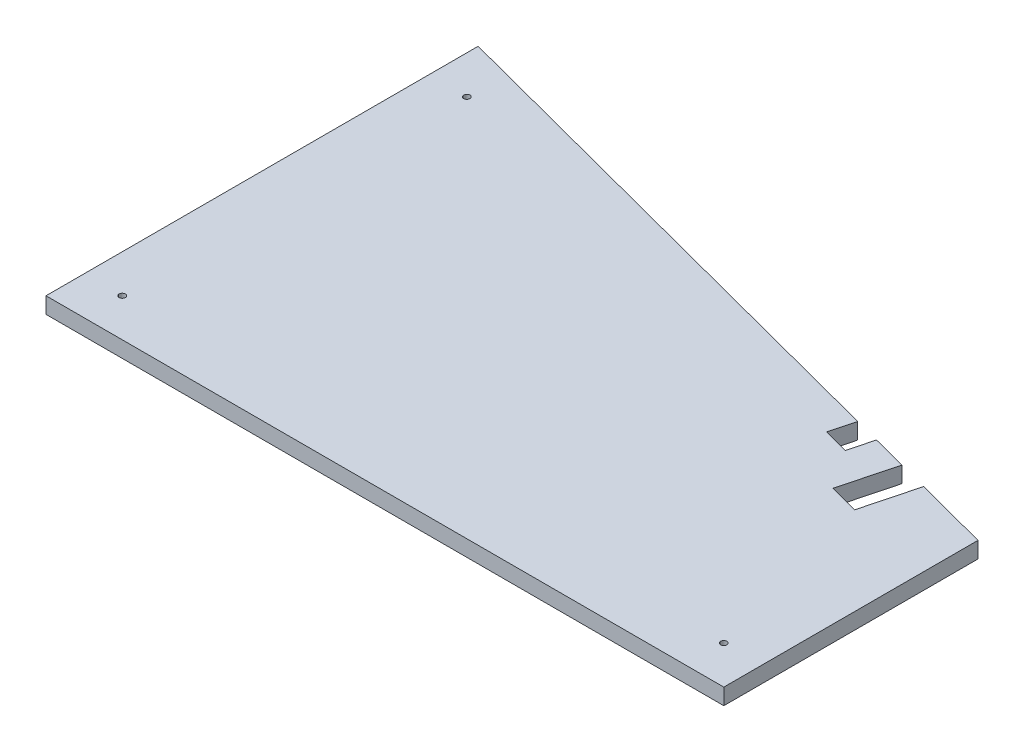
ISO-10303-21;
HEADER;
FILE_DESCRIPTION(('STEP AP214'),'2;1');
FILE_NAME('part.step','',(''),(''),'','','');
FILE_SCHEMA(('AUTOMOTIVE_DESIGN { 1 0 10303 214 1 1 1 1 }'));
ENDSEC;
DATA;
#1=APPLICATION_CONTEXT('core data for automotive mechanical design processes');
#2=APPLICATION_PROTOCOL_DEFINITION('international standard','automotive_design',2000,#1);
#3=PRODUCT_CONTEXT('',#1,'mechanical');
#4=PRODUCT('Part','Part','',(#3));
#5=PRODUCT_RELATED_PRODUCT_CATEGORY('part','',(#4));
#6=PRODUCT_DEFINITION_FORMATION('','',#4);
#7=PRODUCT_DEFINITION_CONTEXT('part definition',#1,'design');
#8=PRODUCT_DEFINITION('design','',#6,#7);
#9=PRODUCT_DEFINITION_SHAPE('','',#8);
#10=(LENGTH_UNIT() NAMED_UNIT(*) SI_UNIT(.MILLI.,.METRE.));
#11=(NAMED_UNIT(*) PLANE_ANGLE_UNIT() SI_UNIT($,.RADIAN.));
#12=(NAMED_UNIT(*) SI_UNIT($,.STERADIAN.) SOLID_ANGLE_UNIT());
#13=UNCERTAINTY_MEASURE_WITH_UNIT(LENGTH_MEASURE(1.E-05),#10,'distance_accuracy_value','');
#14=(GEOMETRIC_REPRESENTATION_CONTEXT(3) GLOBAL_UNCERTAINTY_ASSIGNED_CONTEXT((#13)) GLOBAL_UNIT_ASSIGNED_CONTEXT((#10,
#11,#12)) REPRESENTATION_CONTEXT('',''));
#15=CARTESIAN_POINT('',(0.,0.,0.));
#16=DIRECTION('',(0.,0.,1.));
#17=DIRECTION('',(1.,0.,0.));
#18=AXIS2_PLACEMENT_3D('',#15,#16,#17);
#19=CARTESIAN_POINT('',(-5.71070968291565E-12,6.35,-170.));
#20=DIRECTION('',(1.,0.,0.));
#21=DIRECTION('',(0.,0.,-1.));
#22=AXIS2_PLACEMENT_3D('',#19,#20,#21);
#23=PLANE('',#22);
#24=DIRECTION('',(0.,0.,1.));
#25=VECTOR('',#24,1.);
#26=CARTESIAN_POINT('',(-5.71070968291565E-12,0.,-170.));
#27=LINE('',#26,#25);
#28=CARTESIAN_POINT('',(-5.71070968291565E-12,0.,-170.));
#29=VERTEX_POINT('',#28);
#30=CARTESIAN_POINT('',(0.,0.,0.));
#31=VERTEX_POINT('',#30);
#32=EDGE_CURVE('E153',#29,#31,#27,.T.);
#33=ORIENTED_EDGE('',*,*,#32,.T.);
#34=DIRECTION('',(0.,-1.,0.));
#35=VECTOR('',#34,1.);
#36=CARTESIAN_POINT('',(0.,6.35,0.));
#37=LINE('',#36,#35);
#38=CARTESIAN_POINT('',(0.,6.35,0.));
#39=VERTEX_POINT('',#38);
#40=EDGE_CURVE('E11',#39,#31,#37,.T.);
#41=ORIENTED_EDGE('',*,*,#40,.F.);
#42=DIRECTION('',(0.,0.,1.));
#43=VECTOR('',#42,1.);
#44=CARTESIAN_POINT('',(-5.71070968291565E-12,6.35,-170.));
#45=LINE('',#44,#43);
#46=CARTESIAN_POINT('',(-5.71070968291565E-12,6.35,-170.));
#47=VERTEX_POINT('',#46);
#48=EDGE_CURVE('E176',#47,#39,#45,.T.);
#49=ORIENTED_EDGE('',*,*,#48,.F.);
#50=DIRECTION('',(0.,-1.,0.));
#51=VECTOR('',#50,1.);
#52=CARTESIAN_POINT('',(-5.71070968291565E-12,6.35,-170.));
#53=LINE('',#52,#51);
#54=EDGE_CURVE('E149',#47,#29,#53,.T.);
#55=ORIENTED_EDGE('',*,*,#54,.T.);
#56=EDGE_LOOP('',(#33,#41,#49,#55));
#57=FACE_BOUND('',#56,.T.);
#58=ADVANCED_FACE('F33',(#57),#23,.F.);
#59=CARTESIAN_POINT('',(0.,6.35,0.));
#60=DIRECTION('',(0.,0.,-1.));
#61=DIRECTION('',(-1.,0.,0.));
#62=AXIS2_PLACEMENT_3D('',#59,#60,#61);
#63=PLANE('',#62);
#64=DIRECTION('',(1.,0.,0.));
#65=VECTOR('',#64,1.);
#66=CARTESIAN_POINT('',(0.,0.,0.));
#67=LINE('',#66,#65);
#68=CARTESIAN_POINT('',(266.65,0.,0.));
#69=VERTEX_POINT('',#68);
#70=EDGE_CURVE('E156',#31,#69,#67,.T.);
#71=ORIENTED_EDGE('',*,*,#70,.T.);
#72=DIRECTION('',(0.,-1.,0.));
#73=VECTOR('',#72,1.);
#74=CARTESIAN_POINT('',(266.65,6.35,0.));
#75=LINE('',#74,#73);
#76=CARTESIAN_POINT('',(266.65,6.35,0.));
#77=VERTEX_POINT('',#76);
#78=EDGE_CURVE('E41',#77,#69,#75,.T.);
#79=ORIENTED_EDGE('',*,*,#78,.F.);
#80=DIRECTION('',(1.,0.,0.));
#81=VECTOR('',#80,1.);
#82=CARTESIAN_POINT('',(0.,6.35,0.));
#83=LINE('',#82,#81);
#84=EDGE_CURVE('E104',#39,#77,#83,.T.);
#85=ORIENTED_EDGE('',*,*,#84,.F.);
#86=ORIENTED_EDGE('',*,*,#40,.T.);
#87=EDGE_LOOP('',(#71,#79,#85,#86));
#88=FACE_BOUND('',#87,.T.);
#89=ADVANCED_FACE('F255',(#88),#63,.F.);
#90=CARTESIAN_POINT('',(266.65,6.35,0.));
#91=DIRECTION('',(-1.,0.,0.));
#92=DIRECTION('',(0.,0.,1.));
#93=AXIS2_PLACEMENT_3D('',#90,#91,#92);
#94=PLANE('',#93);
#95=DIRECTION('',(0.,0.,-1.));
#96=VECTOR('',#95,1.);
#97=CARTESIAN_POINT('',(266.65,0.,0.));
#98=LINE('',#97,#96);
#99=CARTESIAN_POINT('',(266.65,0.,-100.));
#100=VERTEX_POINT('',#99);
#101=EDGE_CURVE('E159',#69,#100,#98,.T.);
#102=ORIENTED_EDGE('',*,*,#101,.T.);
#103=DIRECTION('',(0.,-1.,0.));
#104=VECTOR('',#103,1.);
#105=CARTESIAN_POINT('',(266.65,6.35,-100.));
#106=LINE('',#105,#104);
#107=CARTESIAN_POINT('',(266.65,6.35,-100.));
#108=VERTEX_POINT('',#107);
#109=EDGE_CURVE('E195',#108,#100,#106,.T.);
#110=ORIENTED_EDGE('',*,*,#109,.F.);
#111=DIRECTION('',(0.,0.,-1.));
#112=VECTOR('',#111,1.);
#113=CARTESIAN_POINT('',(266.65,6.35,0.));
#114=LINE('',#113,#112);
#115=EDGE_CURVE('E203',#77,#108,#114,.T.);
#116=ORIENTED_EDGE('',*,*,#115,.F.);
#117=ORIENTED_EDGE('',*,*,#78,.T.);
#118=EDGE_LOOP('',(#102,#110,#116,#117));
#119=FACE_BOUND('',#118,.T.);
#120=ADVANCED_FACE('F201',(#119),#94,.F.);
#121=CARTESIAN_POINT('',(266.65,6.35,-100.));
#122=DIRECTION('',(-0.253912974923622,0.,0.967227068048365));
#123=DIRECTION('',(0.967227068048365,0.,0.253912974923622));
#124=AXIS2_PLACEMENT_3D('',#121,#122,#123);
#125=PLANE('',#124);
#126=DIRECTION('',(-0.967227068048365,0.,-0.253912974923622));
#127=VECTOR('',#126,1.);
#128=CARTESIAN_POINT('',(266.65,0.,-100.));
#129=LINE('',#128,#127);
#130=CARTESIAN_POINT('',(237.633187958549,0.,-107.617389247709));
#131=VERTEX_POINT('',#130);
#132=EDGE_CURVE('E161',#100,#131,#129,.T.);
#133=ORIENTED_EDGE('',*,*,#132,.T.);
#134=DIRECTION('',(0.,-1.,0.));
#135=VECTOR('',#134,1.);
#136=CARTESIAN_POINT('',(237.633187958549,6.35,-107.617389247709));
#137=LINE('',#136,#135);
#138=CARTESIAN_POINT('',(237.633187958549,6.35,-107.617389247709));
#139=VERTEX_POINT('',#138);
#140=EDGE_CURVE('E192',#139,#131,#137,.T.);
#141=ORIENTED_EDGE('',*,*,#140,.F.);
#142=DIRECTION('',(-0.967227068048365,0.,-0.253912974923622));
#143=VECTOR('',#142,1.);
#144=CARTESIAN_POINT('',(266.65,6.35,-100.));
#145=LINE('',#144,#143);
#146=EDGE_CURVE('E221',#108,#139,#145,.T.);
#147=ORIENTED_EDGE('',*,*,#146,.F.);
#148=ORIENTED_EDGE('',*,*,#109,.T.);
#149=EDGE_LOOP('',(#133,#141,#147,#148));
#150=FACE_BOUND('',#149,.T.);
#151=ADVANCED_FACE('F212',(#150),#125,.F.);
#152=CARTESIAN_POINT('',(231.996319915245,6.35,-86.1449483370349));
#153=DIRECTION('',(0.967227068048365,0.,0.253912974923621));
#154=DIRECTION('',(0.253912974923621,0.,-0.967227068048365));
#155=AXIS2_PLACEMENT_3D('',#152,#153,#154);
#156=PLANE('',#155);
#157=DIRECTION('',(-0.253912974923621,0.,0.967227068048365));
#158=VECTOR('',#157,1.);
#159=CARTESIAN_POINT('',(231.996319915245,0.,-86.1449483370349));
#160=LINE('',#159,#158);
#161=CARTESIAN_POINT('',(231.996319915245,0.,-86.1449483370349));
#162=VERTEX_POINT('',#161);
#163=EDGE_CURVE('E163',#131,#162,#160,.T.);
#164=ORIENTED_EDGE('',*,*,#163,.T.);
#165=DIRECTION('',(0.,-1.,0.));
#166=VECTOR('',#165,1.);
#167=CARTESIAN_POINT('',(231.996319915245,6.35,-86.1449483370349));
#168=LINE('',#167,#166);
#169=CARTESIAN_POINT('',(231.996319915245,6.35,-86.1449483370349));
#170=VERTEX_POINT('',#169);
#171=EDGE_CURVE('E189',#170,#162,#168,.T.);
#172=ORIENTED_EDGE('',*,*,#171,.F.);
#173=DIRECTION('',(-0.253912974923621,0.,0.967227068048365));
#174=VECTOR('',#173,1.);
#175=CARTESIAN_POINT('',(231.996319915245,6.35,-86.1449483370349));
#176=LINE('',#175,#174);
#177=EDGE_CURVE('E218',#139,#170,#176,.T.);
#178=ORIENTED_EDGE('',*,*,#177,.F.);
#179=ORIENTED_EDGE('',*,*,#140,.T.);
#180=EDGE_LOOP('',(#164,#172,#178,#179));
#181=FACE_BOUND('',#180,.T.);
#182=ADVANCED_FACE('F216',(#181),#156,.F.);
#183=CARTESIAN_POINT('',(220.389595098664,6.35,-89.1919040361184));
#184=DIRECTION('',(-0.253912974923622,0.,0.967227068048365));
#185=DIRECTION('',(0.967227068048365,0.,0.253912974923622));
#186=AXIS2_PLACEMENT_3D('',#183,#184,#185);
#187=PLANE('',#186);
#188=DIRECTION('',(-0.967227068048365,0.,-0.253912974923622));
#189=VECTOR('',#188,1.);
#190=CARTESIAN_POINT('',(220.389595098664,0.,-89.1919040361184));
#191=LINE('',#190,#189);
#192=CARTESIAN_POINT('',(220.389595098664,0.,-89.1919040361184));
#193=VERTEX_POINT('',#192);
#194=EDGE_CURVE('E165',#162,#193,#191,.T.);
#195=ORIENTED_EDGE('',*,*,#194,.T.);
#196=DIRECTION('',(0.,-1.,0.));
#197=VECTOR('',#196,1.);
#198=CARTESIAN_POINT('',(220.389595098664,6.35,-89.1919040361184));
#199=LINE('',#198,#197);
#200=CARTESIAN_POINT('',(220.389595098664,6.35,-89.1919040361184));
#201=VERTEX_POINT('',#200);
#202=EDGE_CURVE('E186',#201,#193,#199,.T.);
#203=ORIENTED_EDGE('',*,*,#202,.F.);
#204=DIRECTION('',(-0.967227068048365,0.,-0.253912974923622));
#205=VECTOR('',#204,1.);
#206=CARTESIAN_POINT('',(220.389595098664,6.35,-89.1919040361184));
#207=LINE('',#206,#205);
#208=EDGE_CURVE('E220',#170,#201,#207,.T.);
#209=ORIENTED_EDGE('',*,*,#208,.F.);
#210=ORIENTED_EDGE('',*,*,#171,.T.);
#211=EDGE_LOOP('',(#195,#203,#209,#210));
#212=FACE_BOUND('',#211,.T.);
#213=ADVANCED_FACE('F268',(#212),#187,.F.);
#214=CARTESIAN_POINT('',(226.026463141969,6.35,-110.664344946792));
#215=DIRECTION('',(-0.967227068048365,0.,-0.253912974923621));
#216=DIRECTION('',(-0.253912974923621,0.,0.967227068048365));
#217=AXIS2_PLACEMENT_3D('',#214,#215,#216);
#218=PLANE('',#217);
#219=DIRECTION('',(0.253912974923621,0.,-0.967227068048365));
#220=VECTOR('',#219,1.);
#221=CARTESIAN_POINT('',(226.026463141969,0.,-110.664344946792));
#222=LINE('',#221,#220);
#223=CARTESIAN_POINT('',(226.026463141969,0.,-110.664344946792));
#224=VERTEX_POINT('',#223);
#225=EDGE_CURVE('E167',#193,#224,#222,.T.);
#226=ORIENTED_EDGE('',*,*,#225,.T.);
#227=DIRECTION('',(0.,-1.,0.));
#228=VECTOR('',#227,1.);
#229=CARTESIAN_POINT('',(226.026463141969,6.35,-110.664344946792));
#230=LINE('',#229,#228);
#231=CARTESIAN_POINT('',(226.026463141969,6.35,-110.664344946792));
#232=VERTEX_POINT('',#231);
#233=EDGE_CURVE('E183',#232,#224,#230,.T.);
#234=ORIENTED_EDGE('',*,*,#233,.F.);
#235=DIRECTION('',(0.253912974923621,0.,-0.967227068048365));
#236=VECTOR('',#235,1.);
#237=CARTESIAN_POINT('',(226.026463141969,6.35,-110.664344946792));
#238=LINE('',#237,#236);
#239=EDGE_CURVE('E223',#201,#232,#238,.T.);
#240=ORIENTED_EDGE('',*,*,#239,.F.);
#241=ORIENTED_EDGE('',*,*,#202,.T.);
#242=EDGE_LOOP('',(#226,#234,#240,#241));
#243=FACE_BOUND('',#242,.T.);
#244=ADVANCED_FACE('F271',(#243),#218,.F.);
#245=CARTESIAN_POINT('',(226.026463141969,6.35,-110.664344946792));
#246=DIRECTION('',(-0.253912974923624,0.,0.967227068048364));
#247=DIRECTION('',(0.967227068048364,0.,0.253912974923624));
#248=AXIS2_PLACEMENT_3D('',#245,#246,#247);
#249=PLANE('',#248);
#250=DIRECTION('',(-0.967227068048364,0.,-0.253912974923624));
#251=VECTOR('',#250,1.);
#252=CARTESIAN_POINT('',(226.026463141969,0.,-110.664344946792));
#253=LINE('',#252,#251);
#254=CARTESIAN_POINT('',(212.485284189292,0.,-114.219126595723));
#255=VERTEX_POINT('',#254);
#256=EDGE_CURVE('E169',#224,#255,#253,.T.);
#257=ORIENTED_EDGE('',*,*,#256,.T.);
#258=DIRECTION('',(0.,-1.,0.));
#259=VECTOR('',#258,1.);
#260=CARTESIAN_POINT('',(212.485284189292,6.35,-114.219126595723));
#261=LINE('',#260,#259);
#262=CARTESIAN_POINT('',(212.485284189292,6.35,-114.219126595723));
#263=VERTEX_POINT('',#262);
#264=EDGE_CURVE('E180',#263,#255,#261,.T.);
#265=ORIENTED_EDGE('',*,*,#264,.F.);
#266=DIRECTION('',(-0.967227068048364,0.,-0.253912974923624));
#267=VECTOR('',#266,1.);
#268=CARTESIAN_POINT('',(226.026463141969,6.35,-110.664344946792));
#269=LINE('',#268,#267);
#270=EDGE_CURVE('E229',#232,#263,#269,.T.);
#271=ORIENTED_EDGE('',*,*,#270,.F.);
#272=ORIENTED_EDGE('',*,*,#233,.T.);
#273=EDGE_LOOP('',(#257,#265,#271,#272));
#274=FACE_BOUND('',#273,.T.);
#275=ADVANCED_FACE('F235',(#274),#249,.F.);
#276=CARTESIAN_POINT('',(209.946154440055,6.35,-104.546855915239));
#277=DIRECTION('',(0.967227068048365,0.,0.253912974923622));
#278=DIRECTION('',(0.253912974923622,0.,-0.967227068048365));
#279=AXIS2_PLACEMENT_3D('',#276,#277,#278);
#280=PLANE('',#279);
#281=DIRECTION('',(-0.253912974923622,0.,0.967227068048365));
#282=VECTOR('',#281,1.);
#283=CARTESIAN_POINT('',(209.946154440055,0.,-104.546855915239));
#284=LINE('',#283,#282);
#285=CARTESIAN_POINT('',(209.946154440055,0.,-104.546855915239));
#286=VERTEX_POINT('',#285);
#287=EDGE_CURVE('E171',#255,#286,#284,.T.);
#288=ORIENTED_EDGE('',*,*,#287,.T.);
#289=DIRECTION('',(0.,-1.,0.));
#290=VECTOR('',#289,1.);
#291=CARTESIAN_POINT('',(209.946154440055,6.35,-104.546855915239));
#292=LINE('',#291,#290);
#293=CARTESIAN_POINT('',(209.946154440055,6.35,-104.546855915239));
#294=VERTEX_POINT('',#293);
#295=EDGE_CURVE('E144',#294,#286,#292,.T.);
#296=ORIENTED_EDGE('',*,*,#295,.F.);
#297=DIRECTION('',(-0.253912974923622,0.,0.967227068048365));
#298=VECTOR('',#297,1.);
#299=CARTESIAN_POINT('',(209.946154440055,6.35,-104.546855915239));
#300=LINE('',#299,#298);
#301=EDGE_CURVE('E135',#263,#294,#300,.T.);
#302=ORIENTED_EDGE('',*,*,#301,.F.);
#303=ORIENTED_EDGE('',*,*,#264,.T.);
#304=EDGE_LOOP('',(#288,#296,#302,#303));
#305=FACE_BOUND('',#304,.T.);
#306=ADVANCED_FACE('F239',(#305),#280,.F.);
#307=CARTESIAN_POINT('',(209.946154440055,6.35,-104.546855915239));
#308=DIRECTION('',(-0.253912974923643,0.,0.967227068048359));
#309=DIRECTION('',(0.967227068048359,0.,0.253912974923643));
#310=AXIS2_PLACEMENT_3D('',#307,#308,#309);
#311=PLANE('',#310);
#312=DIRECTION('',(-0.967227068048359,0.,-0.253912974923643));
#313=VECTOR('',#312,1.);
#314=CARTESIAN_POINT('',(209.946154440055,0.,-104.546855915239));
#315=LINE('',#314,#313);
#316=CARTESIAN_POINT('',(199.946154440055,0.,-107.172019987994));
#317=VERTEX_POINT('',#316);
#318=EDGE_CURVE('E143',#286,#317,#315,.T.);
#319=ORIENTED_EDGE('',*,*,#318,.T.);
#320=DIRECTION('',(0.,-1.,0.));
#321=VECTOR('',#320,1.);
#322=CARTESIAN_POINT('',(199.946154440055,6.35,-107.172019987994));
#323=LINE('',#322,#321);
#324=CARTESIAN_POINT('',(199.946154440055,6.35,-107.172019987994));
#325=VERTEX_POINT('',#324);
#326=EDGE_CURVE('E140',#325,#317,#323,.T.);
#327=ORIENTED_EDGE('',*,*,#326,.F.);
#328=DIRECTION('',(-0.967227068048359,0.,-0.253912974923643));
#329=VECTOR('',#328,1.);
#330=CARTESIAN_POINT('',(209.946154440055,6.35,-104.546855915239));
#331=LINE('',#330,#329);
#332=EDGE_CURVE('E129',#294,#325,#331,.T.);
#333=ORIENTED_EDGE('',*,*,#332,.F.);
#334=ORIENTED_EDGE('',*,*,#295,.T.);
#335=EDGE_LOOP('',(#319,#327,#333,#334));
#336=FACE_BOUND('',#335,.T.);
#337=ADVANCED_FACE('F141',(#336),#311,.F.);
#338=CARTESIAN_POINT('',(199.946154440055,6.35,-107.172019987994));
#339=DIRECTION('',(-0.967227068048365,0.,-0.253912974923623));
#340=DIRECTION('',(-0.253912974923623,0.,0.967227068048365));
#341=AXIS2_PLACEMENT_3D('',#338,#339,#340);
#342=PLANE('',#341);
#343=DIRECTION('',(0.253912974923623,0.,-0.967227068048365));
#344=VECTOR('',#343,1.);
#345=CARTESIAN_POINT('',(199.946154440055,0.,-107.172019987994));
#346=LINE('',#345,#344);
#347=CARTESIAN_POINT('',(202.485284189292,0.,-116.844290668477));
#348=VERTEX_POINT('',#347);
#349=EDGE_CURVE('E90',#317,#348,#346,.T.);
#350=ORIENTED_EDGE('',*,*,#349,.T.);
#351=DIRECTION('',(0.,-1.,0.));
#352=VECTOR('',#351,1.);
#353=CARTESIAN_POINT('',(202.485284189292,6.35,-116.844290668477));
#354=LINE('',#353,#352);
#355=CARTESIAN_POINT('',(202.485284189292,6.35,-116.844290668477));
#356=VERTEX_POINT('',#355);
#357=EDGE_CURVE('E145',#356,#348,#354,.T.);
#358=ORIENTED_EDGE('',*,*,#357,.F.);
#359=DIRECTION('',(0.253912974923623,0.,-0.967227068048365));
#360=VECTOR('',#359,1.);
#361=CARTESIAN_POINT('',(199.946154440055,6.35,-107.172019987994));
#362=LINE('',#361,#360);
#363=EDGE_CURVE('E133',#325,#356,#362,.T.);
#364=ORIENTED_EDGE('',*,*,#363,.F.);
#365=ORIENTED_EDGE('',*,*,#326,.T.);
#366=EDGE_LOOP('',(#350,#358,#364,#365));
#367=FACE_BOUND('',#366,.T.);
#368=ADVANCED_FACE('F147',(#367),#342,.F.);
#369=CARTESIAN_POINT('',(202.485284189292,6.35,-116.844290668477));
#370=DIRECTION('',(-0.253912974923623,0.,0.967227068048364));
#371=DIRECTION('',(0.967227068048364,0.,0.253912974923623));
#372=AXIS2_PLACEMENT_3D('',#369,#370,#371);
#373=PLANE('',#372);
#374=DIRECTION('',(-0.967227068048364,0.,-0.253912974923623));
#375=VECTOR('',#374,1.);
#376=CARTESIAN_POINT('',(202.485284189292,0.,-116.844290668477));
#377=LINE('',#376,#375);
#378=EDGE_CURVE('E96',#348,#29,#377,.T.);
#379=ORIENTED_EDGE('',*,*,#378,.T.);
#380=ORIENTED_EDGE('',*,*,#54,.F.);
#381=DIRECTION('',(-0.967227068048364,0.,-0.253912974923623));
#382=VECTOR('',#381,1.);
#383=CARTESIAN_POINT('',(202.485284189292,6.35,-116.844290668477));
#384=LINE('',#383,#382);
#385=EDGE_CURVE('E49',#356,#47,#384,.T.);
#386=ORIENTED_EDGE('',*,*,#385,.F.);
#387=ORIENTED_EDGE('',*,*,#357,.T.);
#388=EDGE_LOOP('',(#379,#380,#386,#387));
#389=FACE_BOUND('',#388,.T.);
#390=ADVANCED_FACE('F243',(#389),#373,.F.);
#391=CARTESIAN_POINT('',(0.,6.35,0.));
#392=DIRECTION('',(0.,1.,0.));
#393=DIRECTION('',(0.,0.,1.));
#394=AXIS2_PLACEMENT_3D('',#391,#392,#393);
#395=PLANE('',#394);
#396=CARTESIAN_POINT('',(14.9999999999965,6.35,-150.554003041079));
#397=DIRECTION('',(0.,1.,0.));
#398=DIRECTION('',(0.,0.,1.));
#399=AXIS2_PLACEMENT_3D('',#396,#397,#398);
#400=CIRCLE('',#399,1.225);
#401=CARTESIAN_POINT('',(14.9999999999965,6.35,-149.329003041079));
#402=VERTEX_POINT('',#401);
#403=EDGE_CURVE('E346',#402,#402,#400,.T.);
#404=ORIENTED_EDGE('',*,*,#403,.F.);
#405=EDGE_LOOP('',(#404));
#406=FACE_BOUND('',#405,.T.);
#407=CARTESIAN_POINT('',(14.9999999999943,6.35,-15.));
#408=DIRECTION('',(0.,1.,0.));
#409=DIRECTION('',(0.,0.,1.));
#410=AXIS2_PLACEMENT_3D('',#407,#408,#409);
#411=CIRCLE('',#410,1.225);
#412=CARTESIAN_POINT('',(14.9999999999943,6.35,-13.775));
#413=VERTEX_POINT('',#412);
#414=EDGE_CURVE('E351',#413,#413,#411,.T.);
#415=ORIENTED_EDGE('',*,*,#414,.F.);
#416=EDGE_LOOP('',(#415));
#417=FACE_BOUND('',#416,.T.);
#418=CARTESIAN_POINT('',(251.65,6.35,-15.));
#419=DIRECTION('',(0.,1.,0.));
#420=DIRECTION('',(0.,0.,1.));
#421=AXIS2_PLACEMENT_3D('',#418,#419,#420);
#422=CIRCLE('',#421,1.225);
#423=CARTESIAN_POINT('',(251.65,6.35,-13.775));
#424=VERTEX_POINT('',#423);
#425=EDGE_CURVE('E359',#424,#424,#422,.T.);
#426=ORIENTED_EDGE('',*,*,#425,.F.);
#427=EDGE_LOOP('',(#426));
#428=FACE_BOUND('',#427,.T.);
#429=ORIENTED_EDGE('',*,*,#48,.T.);
#430=ORIENTED_EDGE('',*,*,#84,.T.);
#431=ORIENTED_EDGE('',*,*,#115,.T.);
#432=ORIENTED_EDGE('',*,*,#146,.T.);
#433=ORIENTED_EDGE('',*,*,#177,.T.);
#434=ORIENTED_EDGE('',*,*,#208,.T.);
#435=ORIENTED_EDGE('',*,*,#239,.T.);
#436=ORIENTED_EDGE('',*,*,#270,.T.);
#437=ORIENTED_EDGE('',*,*,#301,.T.);
#438=ORIENTED_EDGE('',*,*,#332,.T.);
#439=ORIENTED_EDGE('',*,*,#363,.T.);
#440=ORIENTED_EDGE('',*,*,#385,.T.);
#441=EDGE_LOOP('',(#429,#430,#431,#432,#433,#434,#435,#436,#437,#438,#439,#440));
#442=FACE_BOUND('',#441,.T.);
#443=ADVANCED_FACE('F131',(#406,#417,#428,#442),#395,.T.);
#444=CARTESIAN_POINT('',(0.,0.,0.));
#445=DIRECTION('',(0.,1.,0.));
#446=DIRECTION('',(0.,0.,1.));
#447=AXIS2_PLACEMENT_3D('',#444,#445,#446);
#448=PLANE('',#447);
#449=CARTESIAN_POINT('',(14.9999999999965,0.,-150.554003041079));
#450=DIRECTION('',(0.,1.,0.));
#451=DIRECTION('',(0.,0.,1.));
#452=AXIS2_PLACEMENT_3D('',#449,#450,#451);
#453=CIRCLE('',#452,1.225);
#454=CARTESIAN_POINT('',(14.9999999999965,0.,-149.329003041079));
#455=VERTEX_POINT('',#454);
#456=EDGE_CURVE('E157',#455,#455,#453,.T.);
#457=ORIENTED_EDGE('',*,*,#456,.T.);
#458=EDGE_LOOP('',(#457));
#459=FACE_BOUND('',#458,.T.);
#460=CARTESIAN_POINT('',(14.9999999999943,0.,-15.));
#461=DIRECTION('',(0.,1.,0.));
#462=DIRECTION('',(0.,0.,1.));
#463=AXIS2_PLACEMENT_3D('',#460,#461,#462);
#464=CIRCLE('',#463,1.225);
#465=CARTESIAN_POINT('',(14.9999999999943,0.,-13.775));
#466=VERTEX_POINT('',#465);
#467=EDGE_CURVE('E347',#466,#466,#464,.T.);
#468=ORIENTED_EDGE('',*,*,#467,.T.);
#469=EDGE_LOOP('',(#468));
#470=FACE_BOUND('',#469,.T.);
#471=CARTESIAN_POINT('',(251.65,0.,-15.));
#472=DIRECTION('',(0.,1.,0.));
#473=DIRECTION('',(0.,0.,1.));
#474=AXIS2_PLACEMENT_3D('',#471,#472,#473);
#475=CIRCLE('',#474,1.225);
#476=CARTESIAN_POINT('',(251.65,0.,-13.775));
#477=VERTEX_POINT('',#476);
#478=EDGE_CURVE('E356',#477,#477,#475,.T.);
#479=ORIENTED_EDGE('',*,*,#478,.T.);
#480=EDGE_LOOP('',(#479));
#481=FACE_BOUND('',#480,.T.);
#482=ORIENTED_EDGE('',*,*,#32,.F.);
#483=ORIENTED_EDGE('',*,*,#378,.F.);
#484=ORIENTED_EDGE('',*,*,#349,.F.);
#485=ORIENTED_EDGE('',*,*,#318,.F.);
#486=ORIENTED_EDGE('',*,*,#287,.F.);
#487=ORIENTED_EDGE('',*,*,#256,.F.);
#488=ORIENTED_EDGE('',*,*,#225,.F.);
#489=ORIENTED_EDGE('',*,*,#194,.F.);
#490=ORIENTED_EDGE('',*,*,#163,.F.);
#491=ORIENTED_EDGE('',*,*,#132,.F.);
#492=ORIENTED_EDGE('',*,*,#101,.F.);
#493=ORIENTED_EDGE('',*,*,#70,.F.);
#494=EDGE_LOOP('',(#482,#483,#484,#485,#486,#487,#488,#489,#490,#491,#492,#493));
#495=FACE_BOUND('',#494,.T.);
#496=ADVANCED_FACE('F207',(#459,#470,#481,#495),#448,.F.);
#497=CARTESIAN_POINT('',(251.65,0.,-15.));
#498=DIRECTION('',(0.,1.,0.));
#499=DIRECTION('',(0.,0.,1.));
#500=AXIS2_PLACEMENT_3D('',#497,#498,#499);
#501=CYLINDRICAL_SURFACE('',#500,1.225);
#502=ORIENTED_EDGE('',*,*,#478,.F.);
#503=EDGE_LOOP('',(#502));
#504=FACE_BOUND('',#503,.T.);
#505=ORIENTED_EDGE('',*,*,#425,.T.);
#506=EDGE_LOOP('',(#505));
#507=FACE_BOUND('',#506,.T.);
#508=ADVANCED_FACE('F308',(#504,#507),#501,.F.);
#509=CARTESIAN_POINT('',(14.9999999999943,0.,-15.));
#510=DIRECTION('',(0.,1.,0.));
#511=DIRECTION('',(0.,0.,1.));
#512=AXIS2_PLACEMENT_3D('',#509,#510,#511);
#513=CYLINDRICAL_SURFACE('',#512,1.225);
#514=ORIENTED_EDGE('',*,*,#467,.F.);
#515=EDGE_LOOP('',(#514));
#516=FACE_BOUND('',#515,.T.);
#517=ORIENTED_EDGE('',*,*,#414,.T.);
#518=EDGE_LOOP('',(#517));
#519=FACE_BOUND('',#518,.T.);
#520=ADVANCED_FACE('F317',(#516,#519),#513,.F.);
#521=CARTESIAN_POINT('',(14.9999999999965,0.,-150.554003041079));
#522=DIRECTION('',(0.,1.,0.));
#523=DIRECTION('',(0.,0.,1.));
#524=AXIS2_PLACEMENT_3D('',#521,#522,#523);
#525=CYLINDRICAL_SURFACE('',#524,1.225);
#526=ORIENTED_EDGE('',*,*,#456,.F.);
#527=EDGE_LOOP('',(#526));
#528=FACE_BOUND('',#527,.T.);
#529=ORIENTED_EDGE('',*,*,#403,.T.);
#530=EDGE_LOOP('',(#529));
#531=FACE_BOUND('',#530,.T.);
#532=ADVANCED_FACE('F327',(#528,#531),#525,.F.);
#533=CLOSED_SHELL('',(#58,#89,#120,#151,#182,#213,#244,#275,#306,#337,#368,#390,#443,#496,#508,
#520,#532));
#534=MANIFOLD_SOLID_BREP('B2',#533);
#535=ADVANCED_BREP_SHAPE_REPRESENTATION('',(#18,#534),#14);
#536=SHAPE_DEFINITION_REPRESENTATION(#9,#535);
ENDSEC;
END-ISO-10303-21;
